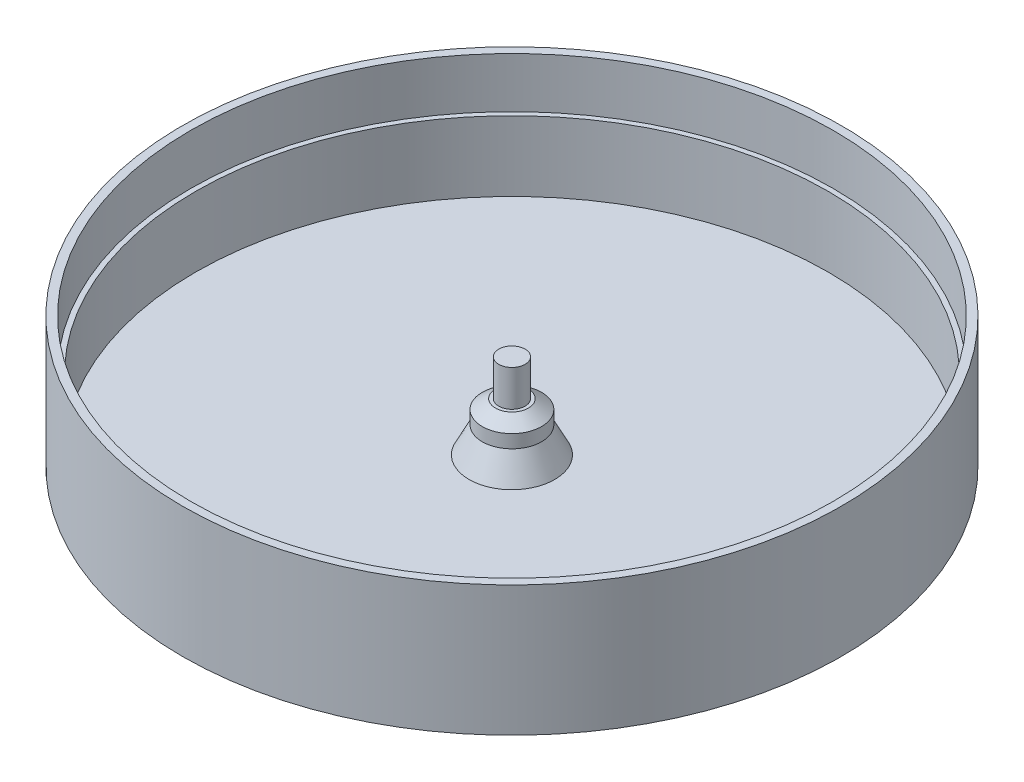
ISO-10303-21;
HEADER;
FILE_DESCRIPTION(('STEP AP214'),'2;1');
FILE_NAME('part.step','',(''),(''),'','','');
FILE_SCHEMA(('AUTOMOTIVE_DESIGN { 1 0 10303 214 1 1 1 1 }'));
ENDSEC;
DATA;
#1=APPLICATION_CONTEXT('core data for automotive mechanical design processes');
#2=APPLICATION_PROTOCOL_DEFINITION('international standard','automotive_design',2000,#1);
#3=PRODUCT_CONTEXT('',#1,'mechanical');
#4=PRODUCT('Part','Part','',(#3));
#5=PRODUCT_RELATED_PRODUCT_CATEGORY('part','',(#4));
#6=PRODUCT_DEFINITION_FORMATION('','',#4);
#7=PRODUCT_DEFINITION_CONTEXT('part definition',#1,'design');
#8=PRODUCT_DEFINITION('design','',#6,#7);
#9=PRODUCT_DEFINITION_SHAPE('','',#8);
#10=(LENGTH_UNIT() NAMED_UNIT(*) SI_UNIT(.MILLI.,.METRE.));
#11=(NAMED_UNIT(*) PLANE_ANGLE_UNIT() SI_UNIT($,.RADIAN.));
#12=(NAMED_UNIT(*) SI_UNIT($,.STERADIAN.) SOLID_ANGLE_UNIT());
#13=UNCERTAINTY_MEASURE_WITH_UNIT(LENGTH_MEASURE(1.E-05),#10,'distance_accuracy_value','');
#14=(GEOMETRIC_REPRESENTATION_CONTEXT(3) GLOBAL_UNCERTAINTY_ASSIGNED_CONTEXT((#13)) GLOBAL_UNIT_ASSIGNED_CONTEXT((#10,
#11,#12)) REPRESENTATION_CONTEXT('',''));
#15=CARTESIAN_POINT('',(0.,0.,0.));
#16=DIRECTION('',(0.,0.,1.));
#17=DIRECTION('',(1.,0.,0.));
#18=AXIS2_PLACEMENT_3D('',#15,#16,#17);
#19=CARTESIAN_POINT('',(0.,3.,0.));
#20=DIRECTION('',(0.,1.,0.));
#21=DIRECTION('',(0.,0.,1.));
#22=AXIS2_PLACEMENT_3D('',#19,#20,#21);
#23=PLANE('',#22);
#24=CARTESIAN_POINT('',(0.,3.,0.));
#25=DIRECTION('',(0.,1.,0.));
#26=DIRECTION('',(0.,0.,1.));
#27=AXIS2_PLACEMENT_3D('',#24,#25,#26);
#28=CIRCLE('',#27,13.);
#29=CARTESIAN_POINT('',(0.,3.,13.));
#30=VERTEX_POINT('',#29);
#31=EDGE_CURVE('E10',#30,#30,#28,.T.);
#32=ORIENTED_EDGE('',*,*,#31,.F.);
#33=EDGE_LOOP('',(#32));
#34=FACE_BOUND('',#33,.T.);
#35=CARTESIAN_POINT('',(0.,3.,0.));
#36=DIRECTION('',(0.,1.,0.));
#37=DIRECTION('',(0.,0.,1.));
#38=AXIS2_PLACEMENT_3D('',#35,#36,#37);
#39=CIRCLE('',#38,96.);
#40=CARTESIAN_POINT('',(0.,3.,96.));
#41=VERTEX_POINT('',#40);
#42=EDGE_CURVE('E51',#41,#41,#39,.F.);
#43=ORIENTED_EDGE('',*,*,#42,.F.);
#44=EDGE_LOOP('',(#43));
#45=FACE_BOUND('',#44,.T.);
#46=ADVANCED_FACE('F43',(#34,#45),#23,.T.);
#47=CARTESIAN_POINT('',(0.,24.22,0.));
#48=DIRECTION('',(0.,-1.,0.));
#49=DIRECTION('',(0.,0.,-1.));
#50=AXIS2_PLACEMENT_3D('',#47,#48,#49);
#51=CYLINDRICAL_SURFACE('',#50,96.);
#52=ORIENTED_EDGE('',*,*,#42,.T.);
#53=EDGE_LOOP('',(#52));
#54=FACE_BOUND('',#53,.T.);
#55=CARTESIAN_POINT('',(0.,24.22,0.));
#56=DIRECTION('',(0.,1.,0.));
#57=DIRECTION('',(0.,0.,1.));
#58=AXIS2_PLACEMENT_3D('',#55,#56,#57);
#59=CIRCLE('',#58,96.);
#60=CARTESIAN_POINT('',(0.,24.22,96.));
#61=VERTEX_POINT('',#60);
#62=EDGE_CURVE('E56',#61,#61,#59,.T.);
#63=ORIENTED_EDGE('',*,*,#62,.T.);
#64=EDGE_LOOP('',(#63));
#65=FACE_BOUND('',#64,.T.);
#66=ADVANCED_FACE('F116',(#54,#65),#51,.F.);
#67=CARTESIAN_POINT('',(0.,24.22,0.));
#68=DIRECTION('',(0.,1.,0.));
#69=DIRECTION('',(0.,0.,1.));
#70=AXIS2_PLACEMENT_3D('',#67,#68,#69);
#71=PLANE('',#70);
#72=ORIENTED_EDGE('',*,*,#62,.F.);
#73=EDGE_LOOP('',(#72));
#74=FACE_BOUND('',#73,.T.);
#75=CARTESIAN_POINT('',(0.,24.22,0.));
#76=DIRECTION('',(0.,1.,0.));
#77=DIRECTION('',(0.,0.,1.));
#78=AXIS2_PLACEMENT_3D('',#75,#76,#77);
#79=CIRCLE('',#78,97.5);
#80=CARTESIAN_POINT('',(0.,24.22,97.5));
#81=VERTEX_POINT('',#80);
#82=EDGE_CURVE('E61',#81,#81,#79,.F.);
#83=ORIENTED_EDGE('',*,*,#82,.F.);
#84=EDGE_LOOP('',(#83));
#85=FACE_BOUND('',#84,.T.);
#86=ADVANCED_FACE('F121',(#74,#85),#71,.T.);
#87=CARTESIAN_POINT('',(0.,39.5,0.));
#88=DIRECTION('',(0.,-1.,0.));
#89=DIRECTION('',(0.,0.,-1.));
#90=AXIS2_PLACEMENT_3D('',#87,#88,#89);
#91=CYLINDRICAL_SURFACE('',#90,97.5);
#92=ORIENTED_EDGE('',*,*,#82,.T.);
#93=EDGE_LOOP('',(#92));
#94=FACE_BOUND('',#93,.T.);
#95=CARTESIAN_POINT('',(0.,39.5,0.));
#96=DIRECTION('',(0.,1.,0.));
#97=DIRECTION('',(0.,0.,1.));
#98=AXIS2_PLACEMENT_3D('',#95,#96,#97);
#99=CIRCLE('',#98,97.5);
#100=CARTESIAN_POINT('',(0.,39.5,97.5));
#101=VERTEX_POINT('',#100);
#102=EDGE_CURVE('E72',#101,#101,#99,.T.);
#103=ORIENTED_EDGE('',*,*,#102,.T.);
#104=EDGE_LOOP('',(#103));
#105=FACE_BOUND('',#104,.T.);
#106=ADVANCED_FACE('F127',(#94,#105),#91,.F.);
#107=CARTESIAN_POINT('',(0.,39.5,0.));
#108=DIRECTION('',(0.,-1.,0.));
#109=DIRECTION('',(0.,0.,-1.));
#110=AXIS2_PLACEMENT_3D('',#107,#108,#109);
#111=CYLINDRICAL_SURFACE('',#110,100.);
#112=CARTESIAN_POINT('',(0.,39.5,0.));
#113=DIRECTION('',(0.,1.,0.));
#114=DIRECTION('',(0.,0.,1.));
#115=AXIS2_PLACEMENT_3D('',#112,#113,#114);
#116=CIRCLE('',#115,100.);
#117=CARTESIAN_POINT('',(0.,39.5,100.));
#118=VERTEX_POINT('',#117);
#119=EDGE_CURVE('E67',#118,#118,#116,.T.);
#120=ORIENTED_EDGE('',*,*,#119,.F.);
#121=EDGE_LOOP('',(#120));
#122=FACE_BOUND('',#121,.T.);
#123=CARTESIAN_POINT('',(0.,0.,0.));
#124=DIRECTION('',(0.,1.,0.));
#125=DIRECTION('',(0.,0.,1.));
#126=AXIS2_PLACEMENT_3D('',#123,#124,#125);
#127=CIRCLE('',#126,100.);
#128=CARTESIAN_POINT('',(0.,0.,100.));
#129=VERTEX_POINT('',#128);
#130=EDGE_CURVE('E68',#129,#129,#127,.T.);
#131=ORIENTED_EDGE('',*,*,#130,.T.);
#132=EDGE_LOOP('',(#131));
#133=FACE_BOUND('',#132,.T.);
#134=ADVANCED_FACE('F131',(#122,#133),#111,.T.);
#135=CARTESIAN_POINT('',(0.,39.5,0.));
#136=DIRECTION('',(0.,1.,0.));
#137=DIRECTION('',(0.,0.,1.));
#138=AXIS2_PLACEMENT_3D('',#135,#136,#137);
#139=PLANE('',#138);
#140=ORIENTED_EDGE('',*,*,#102,.F.);
#141=EDGE_LOOP('',(#140));
#142=FACE_BOUND('',#141,.T.);
#143=ORIENTED_EDGE('',*,*,#119,.T.);
#144=EDGE_LOOP('',(#143));
#145=FACE_BOUND('',#144,.T.);
#146=ADVANCED_FACE('F135',(#142,#145),#139,.T.);
#147=CARTESIAN_POINT('',(0.,0.,0.));
#148=DIRECTION('',(0.,1.,0.));
#149=DIRECTION('',(0.,0.,1.));
#150=AXIS2_PLACEMENT_3D('',#147,#148,#149);
#151=PLANE('',#150);
#152=ORIENTED_EDGE('',*,*,#130,.F.);
#153=EDGE_LOOP('',(#152));
#154=FACE_BOUND('',#153,.T.);
#155=ADVANCED_FACE('F45',(#154),#151,.F.);
#156=CARTESIAN_POINT('',(0.,10.9188400056225,0.));
#157=DIRECTION('',(0.,-1.,0.));
#158=DIRECTION('',(1.,0.,0.));
#159=AXIS2_PLACEMENT_3D('',#156,#157,#158);
#160=CONICAL_SURFACE('',#159,9.,0.467738790102567);
#161=ORIENTED_EDGE('',*,*,#31,.T.);
#162=EDGE_LOOP('',(#161));
#163=FACE_BOUND('',#162,.T.);
#164=CARTESIAN_POINT('',(0.,10.9188400056225,0.));
#165=DIRECTION('',(0.,1.,0.));
#166=DIRECTION('',(-1.,0.,0.));
#167=AXIS2_PLACEMENT_3D('',#164,#165,#166);
#168=CIRCLE('',#167,8.99999999999999);
#169=CARTESIAN_POINT('',(-8.99999999999999,10.9188400056225,0.));
#170=VERTEX_POINT('',#169);
#171=EDGE_CURVE('E73',#170,#170,#168,.T.);
#172=ORIENTED_EDGE('',*,*,#171,.F.);
#173=EDGE_LOOP('',(#172));
#174=FACE_BOUND('',#173,.T.);
#175=ADVANCED_FACE('F140',(#163,#174),#160,.T.);
#176=CARTESIAN_POINT('',(0.,32.411214841673,0.));
#177=DIRECTION('',(0.,1.,0.));
#178=DIRECTION('',(-1.,0.,0.));
#179=AXIS2_PLACEMENT_3D('',#176,#177,#178);
#180=CYLINDRICAL_SURFACE('',#179,9.);
#181=ORIENTED_EDGE('',*,*,#171,.T.);
#182=EDGE_LOOP('',(#181));
#183=FACE_BOUND('',#182,.T.);
#184=CARTESIAN_POINT('',(0.,14.9188400056225,0.));
#185=DIRECTION('',(0.,1.,0.));
#186=DIRECTION('',(-1.,0.,0.));
#187=AXIS2_PLACEMENT_3D('',#184,#185,#186);
#188=CIRCLE('',#187,8.99999999999999);
#189=CARTESIAN_POINT('',(-8.99999999999999,14.9188400056225,0.));
#190=VERTEX_POINT('',#189);
#191=EDGE_CURVE('E83',#190,#190,#188,.T.);
#192=ORIENTED_EDGE('',*,*,#191,.F.);
#193=EDGE_LOOP('',(#192));
#194=FACE_BOUND('',#193,.T.);
#195=ADVANCED_FACE('F143',(#183,#194),#180,.T.);
#196=CARTESIAN_POINT('',(0.,17.7685237444706,0.));
#197=DIRECTION('',(0.,-1.,0.));
#198=DIRECTION('',(1.,0.,0.));
#199=AXIS2_PLACEMENT_3D('',#196,#197,#198);
#200=CONICAL_SURFACE('',#199,5.,0.951782716688464);
#201=ORIENTED_EDGE('',*,*,#191,.T.);
#202=EDGE_LOOP('',(#201));
#203=FACE_BOUND('',#202,.T.);
#204=CARTESIAN_POINT('',(0.,17.7685237444706,0.));
#205=DIRECTION('',(0.,1.,0.));
#206=DIRECTION('',(-1.,0.,0.));
#207=AXIS2_PLACEMENT_3D('',#204,#205,#206);
#208=CIRCLE('',#207,5.);
#209=CARTESIAN_POINT('',(-5.,17.7685237444706,0.));
#210=VERTEX_POINT('',#209);
#211=EDGE_CURVE('E87',#210,#210,#208,.T.);
#212=ORIENTED_EDGE('',*,*,#211,.F.);
#213=EDGE_LOOP('',(#212));
#214=FACE_BOUND('',#213,.T.);
#215=ADVANCED_FACE('F112',(#203,#214),#200,.T.);
#216=CARTESIAN_POINT('',(-5.,17.7685237444706,0.));
#217=DIRECTION('',(0.,1.,0.));
#218=DIRECTION('',(-1.,0.,0.));
#219=AXIS2_PLACEMENT_3D('',#216,#217,#218);
#220=PLANE('',#219);
#221=ORIENTED_EDGE('',*,*,#211,.T.);
#222=EDGE_LOOP('',(#221));
#223=FACE_BOUND('',#222,.T.);
#224=CARTESIAN_POINT('',(0.,17.7685237444706,0.));
#225=DIRECTION('',(0.,1.,0.));
#226=DIRECTION('',(-1.,0.,0.));
#227=AXIS2_PLACEMENT_3D('',#224,#225,#226);
#228=CIRCLE('',#227,4.);
#229=CARTESIAN_POINT('',(-4.,17.7685237444706,0.));
#230=VERTEX_POINT('',#229);
#231=EDGE_CURVE('E91',#230,#230,#228,.T.);
#232=ORIENTED_EDGE('',*,*,#231,.F.);
#233=EDGE_LOOP('',(#232));
#234=FACE_BOUND('',#233,.T.);
#235=ADVANCED_FACE('F104',(#223,#234),#220,.T.);
#236=CARTESIAN_POINT('',(0.,32.411214841673,0.));
#237=DIRECTION('',(0.,1.,0.));
#238=DIRECTION('',(-1.,0.,0.));
#239=AXIS2_PLACEMENT_3D('',#236,#237,#238);
#240=CYLINDRICAL_SURFACE('',#239,4.);
#241=ORIENTED_EDGE('',*,*,#231,.T.);
#242=EDGE_LOOP('',(#241));
#243=FACE_BOUND('',#242,.T.);
#244=CARTESIAN_POINT('',(0.,28.7685237444706,0.));
#245=DIRECTION('',(0.,1.,0.));
#246=DIRECTION('',(-1.,0.,0.));
#247=AXIS2_PLACEMENT_3D('',#244,#245,#246);
#248=CIRCLE('',#247,4.);
#249=CARTESIAN_POINT('',(-4.,28.7685237444706,0.));
#250=VERTEX_POINT('',#249);
#251=EDGE_CURVE('E95',#250,#250,#248,.T.);
#252=ORIENTED_EDGE('',*,*,#251,.F.);
#253=EDGE_LOOP('',(#252));
#254=FACE_BOUND('',#253,.T.);
#255=ADVANCED_FACE('F102',(#243,#254),#240,.T.);
#256=CARTESIAN_POINT('',(-4.,28.7685237444706,0.));
#257=DIRECTION('',(0.,1.,0.));
#258=DIRECTION('',(-1.,0.,0.));
#259=AXIS2_PLACEMENT_3D('',#256,#257,#258);
#260=PLANE('',#259);
#261=ORIENTED_EDGE('',*,*,#251,.T.);
#262=EDGE_LOOP('',(#261));
#263=FACE_BOUND('',#262,.T.);
#264=ADVANCED_FACE('F100',(#263),#260,.T.);
#265=CLOSED_SHELL('',(#46,#66,#86,#106,#134,#146,#155,#175,#195,#215,#235,#255,#264));
#266=MANIFOLD_SOLID_BREP('B2',#265);
#267=ADVANCED_BREP_SHAPE_REPRESENTATION('',(#18,#266),#14);
#268=SHAPE_DEFINITION_REPRESENTATION(#9,#267);
ENDSEC;
END-ISO-10303-21;
